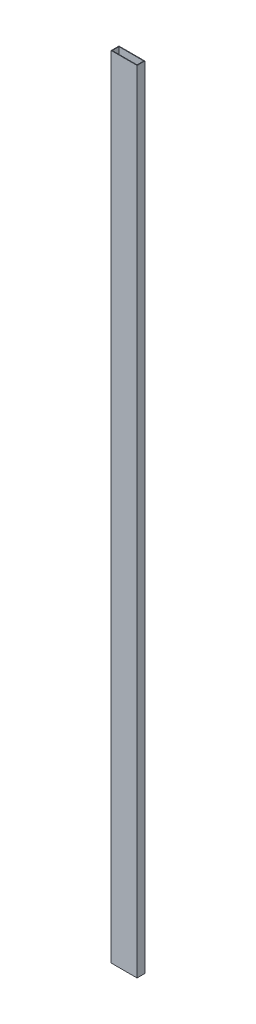
ISO-10303-21;
HEADER;
FILE_DESCRIPTION(('STEP AP214'),'2;1');
FILE_NAME('part.step','',(''),(''),'','','');
FILE_SCHEMA(('AUTOMOTIVE_DESIGN { 1 0 10303 214 1 1 1 1 }'));
ENDSEC;
DATA;
#1=APPLICATION_CONTEXT('core data for automotive mechanical design processes');
#2=APPLICATION_PROTOCOL_DEFINITION('international standard','automotive_design',2000,#1);
#3=PRODUCT_CONTEXT('',#1,'mechanical');
#4=PRODUCT('Part','Part','',(#3));
#5=PRODUCT_RELATED_PRODUCT_CATEGORY('part','',(#4));
#6=PRODUCT_DEFINITION_FORMATION('','',#4);
#7=PRODUCT_DEFINITION_CONTEXT('part definition',#1,'design');
#8=PRODUCT_DEFINITION('design','',#6,#7);
#9=PRODUCT_DEFINITION_SHAPE('','',#8);
#10=(LENGTH_UNIT() NAMED_UNIT(*) SI_UNIT(.MILLI.,.METRE.));
#11=(NAMED_UNIT(*) PLANE_ANGLE_UNIT() SI_UNIT($,.RADIAN.));
#12=(NAMED_UNIT(*) SI_UNIT($,.STERADIAN.) SOLID_ANGLE_UNIT());
#13=UNCERTAINTY_MEASURE_WITH_UNIT(LENGTH_MEASURE(1.E-05),#10,'distance_accuracy_value','');
#14=(GEOMETRIC_REPRESENTATION_CONTEXT(3) GLOBAL_UNCERTAINTY_ASSIGNED_CONTEXT((#13)) GLOBAL_UNIT_ASSIGNED_CONTEXT((#10,
#11,#12)) REPRESENTATION_CONTEXT('',''));
#15=CARTESIAN_POINT('',(0.,0.,0.));
#16=DIRECTION('',(0.,0.,1.));
#17=DIRECTION('',(1.,0.,0.));
#18=AXIS2_PLACEMENT_3D('',#15,#16,#17);
#19=CARTESIAN_POINT('',(0.,3050.,0.));
#20=DIRECTION('',(0.,-1.,0.));
#21=DIRECTION('',(0.,0.,-1.));
#22=AXIS2_PLACEMENT_3D('',#19,#20,#21);
#23=PLANE('',#22);
#24=DIRECTION('',(0.,0.,-1.));
#25=VECTOR('',#24,1.);
#26=CARTESIAN_POINT('',(50.,3050.,15.));
#27=LINE('',#26,#25);
#28=CARTESIAN_POINT('',(50.,3050.,15.));
#29=VERTEX_POINT('',#28);
#30=CARTESIAN_POINT('',(50.,3050.,-15.));
#31=VERTEX_POINT('',#30);
#32=EDGE_CURVE('E153',#29,#31,#27,.T.);
#33=ORIENTED_EDGE('',*,*,#32,.T.);
#34=DIRECTION('',(-1.,0.,0.));
#35=VECTOR('',#34,1.);
#36=CARTESIAN_POINT('',(-50.,3050.,-15.));
#37=LINE('',#36,#35);
#38=CARTESIAN_POINT('',(-50.,3050.,-15.));
#39=VERTEX_POINT('',#38);
#40=EDGE_CURVE('E157',#31,#39,#37,.T.);
#41=ORIENTED_EDGE('',*,*,#40,.T.);
#42=DIRECTION('',(0.,0.,1.));
#43=VECTOR('',#42,1.);
#44=CARTESIAN_POINT('',(-50.,3050.,15.));
#45=LINE('',#44,#43);
#46=CARTESIAN_POINT('',(-50.,3050.,15.));
#47=VERTEX_POINT('',#46);
#48=EDGE_CURVE('E161',#39,#47,#45,.T.);
#49=ORIENTED_EDGE('',*,*,#48,.T.);
#50=DIRECTION('',(1.,0.,0.));
#51=VECTOR('',#50,1.);
#52=CARTESIAN_POINT('',(-50.,3050.,15.));
#53=LINE('',#52,#51);
#54=EDGE_CURVE('E164',#47,#29,#53,.T.);
#55=ORIENTED_EDGE('',*,*,#54,.T.);
#56=EDGE_LOOP('',(#33,#41,#49,#55));
#57=FACE_BOUND('',#56,.T.);
#58=DIRECTION('',(1.,0.,0.));
#59=VECTOR('',#58,1.);
#60=CARTESIAN_POINT('',(-48.,3050.,13.));
#61=LINE('',#60,#59);
#62=CARTESIAN_POINT('',(-48.,3050.,13.));
#63=VERTEX_POINT('',#62);
#64=CARTESIAN_POINT('',(48.,3050.,13.));
#65=VERTEX_POINT('',#64);
#66=EDGE_CURVE('E105',#63,#65,#61,.T.);
#67=ORIENTED_EDGE('',*,*,#66,.F.);
#68=DIRECTION('',(0.,0.,1.));
#69=VECTOR('',#68,1.);
#70=CARTESIAN_POINT('',(-48.,3050.,13.));
#71=LINE('',#70,#69);
#72=CARTESIAN_POINT('',(-48.,3050.,-13.));
#73=VERTEX_POINT('',#72);
#74=EDGE_CURVE('E131',#73,#63,#71,.T.);
#75=ORIENTED_EDGE('',*,*,#74,.F.);
#76=DIRECTION('',(-1.,0.,0.));
#77=VECTOR('',#76,1.);
#78=CARTESIAN_POINT('',(-48.,3050.,-13.));
#79=LINE('',#78,#77);
#80=CARTESIAN_POINT('',(48.,3050.,-13.));
#81=VERTEX_POINT('',#80);
#82=EDGE_CURVE('E127',#81,#73,#79,.T.);
#83=ORIENTED_EDGE('',*,*,#82,.F.);
#84=DIRECTION('',(0.,0.,-1.));
#85=VECTOR('',#84,1.);
#86=CARTESIAN_POINT('',(48.,3050.,13.));
#87=LINE('',#86,#85);
#88=EDGE_CURVE('E114',#65,#81,#87,.T.);
#89=ORIENTED_EDGE('',*,*,#88,.F.);
#90=EDGE_LOOP('',(#67,#75,#83,#89));
#91=FACE_BOUND('',#90,.T.);
#92=ADVANCED_FACE('F39',(#57,#91),#23,.F.);
#93=CARTESIAN_POINT('',(0.,0.,0.));
#94=DIRECTION('',(0.,-1.,0.));
#95=DIRECTION('',(0.,0.,-1.));
#96=AXIS2_PLACEMENT_3D('',#93,#94,#95);
#97=PLANE('',#96);
#98=DIRECTION('',(0.,0.,-1.));
#99=VECTOR('',#98,1.);
#100=CARTESIAN_POINT('',(50.,0.,15.));
#101=LINE('',#100,#99);
#102=CARTESIAN_POINT('',(50.,0.,15.));
#103=VERTEX_POINT('',#102);
#104=CARTESIAN_POINT('',(50.,0.,-15.));
#105=VERTEX_POINT('',#104);
#106=EDGE_CURVE('E123',#103,#105,#101,.T.);
#107=ORIENTED_EDGE('',*,*,#106,.F.);
#108=DIRECTION('',(1.,0.,0.));
#109=VECTOR('',#108,1.);
#110=CARTESIAN_POINT('',(-50.,0.,15.));
#111=LINE('',#110,#109);
#112=CARTESIAN_POINT('',(-50.,0.,15.));
#113=VERTEX_POINT('',#112);
#114=EDGE_CURVE('E158',#113,#103,#111,.T.);
#115=ORIENTED_EDGE('',*,*,#114,.F.);
#116=DIRECTION('',(0.,0.,1.));
#117=VECTOR('',#116,1.);
#118=CARTESIAN_POINT('',(-50.,0.,15.));
#119=LINE('',#118,#117);
#120=CARTESIAN_POINT('',(-50.,0.,-15.));
#121=VERTEX_POINT('',#120);
#122=EDGE_CURVE('E174',#121,#113,#119,.T.);
#123=ORIENTED_EDGE('',*,*,#122,.F.);
#124=DIRECTION('',(-1.,0.,0.));
#125=VECTOR('',#124,1.);
#126=CARTESIAN_POINT('',(-50.,0.,-15.));
#127=LINE('',#126,#125);
#128=EDGE_CURVE('E171',#105,#121,#127,.T.);
#129=ORIENTED_EDGE('',*,*,#128,.F.);
#130=EDGE_LOOP('',(#107,#115,#123,#129));
#131=FACE_BOUND('',#130,.T.);
#132=DIRECTION('',(0.,0.,1.));
#133=VECTOR('',#132,1.);
#134=CARTESIAN_POINT('',(-48.,0.,13.));
#135=LINE('',#134,#133);
#136=CARTESIAN_POINT('',(-48.,0.,-13.));
#137=VERTEX_POINT('',#136);
#138=CARTESIAN_POINT('',(-48.,0.,13.));
#139=VERTEX_POINT('',#138);
#140=EDGE_CURVE('E115',#137,#139,#135,.T.);
#141=ORIENTED_EDGE('',*,*,#140,.T.);
#142=DIRECTION('',(1.,0.,0.));
#143=VECTOR('',#142,1.);
#144=CARTESIAN_POINT('',(-48.,0.,13.));
#145=LINE('',#144,#143);
#146=CARTESIAN_POINT('',(48.,0.,13.));
#147=VERTEX_POINT('',#146);
#148=EDGE_CURVE('E63',#139,#147,#145,.T.);
#149=ORIENTED_EDGE('',*,*,#148,.T.);
#150=DIRECTION('',(0.,0.,-1.));
#151=VECTOR('',#150,1.);
#152=CARTESIAN_POINT('',(48.,0.,13.));
#153=LINE('',#152,#151);
#154=CARTESIAN_POINT('',(48.,0.,-13.));
#155=VERTEX_POINT('',#154);
#156=EDGE_CURVE('E121',#147,#155,#153,.T.);
#157=ORIENTED_EDGE('',*,*,#156,.T.);
#158=DIRECTION('',(-1.,0.,0.));
#159=VECTOR('',#158,1.);
#160=CARTESIAN_POINT('',(-48.,0.,-13.));
#161=LINE('',#160,#159);
#162=EDGE_CURVE('E140',#155,#137,#161,.T.);
#163=ORIENTED_EDGE('',*,*,#162,.T.);
#164=EDGE_LOOP('',(#141,#149,#157,#163));
#165=FACE_BOUND('',#164,.T.);
#166=ADVANCED_FACE('F197',(#131,#165),#97,.T.);
#167=CARTESIAN_POINT('',(50.,3050.,15.));
#168=DIRECTION('',(-1.,0.,0.));
#169=DIRECTION('',(0.,0.,1.));
#170=AXIS2_PLACEMENT_3D('',#167,#168,#169);
#171=PLANE('',#170);
#172=ORIENTED_EDGE('',*,*,#106,.T.);
#173=DIRECTION('',(0.,-1.,0.));
#174=VECTOR('',#173,1.);
#175=CARTESIAN_POINT('',(50.,3050.,-15.));
#176=LINE('',#175,#174);
#177=EDGE_CURVE('E11',#31,#105,#176,.T.);
#178=ORIENTED_EDGE('',*,*,#177,.F.);
#179=ORIENTED_EDGE('',*,*,#32,.F.);
#180=DIRECTION('',(0.,-1.,0.));
#181=VECTOR('',#180,1.);
#182=CARTESIAN_POINT('',(50.,3050.,15.));
#183=LINE('',#182,#181);
#184=EDGE_CURVE('E167',#29,#103,#183,.T.);
#185=ORIENTED_EDGE('',*,*,#184,.T.);
#186=EDGE_LOOP('',(#172,#178,#179,#185));
#187=FACE_BOUND('',#186,.T.);
#188=ADVANCED_FACE('F41',(#187),#171,.F.);
#189=CARTESIAN_POINT('',(-50.,3050.,-15.));
#190=DIRECTION('',(0.,0.,1.));
#191=DIRECTION('',(1.,0.,0.));
#192=AXIS2_PLACEMENT_3D('',#189,#190,#191);
#193=PLANE('',#192);
#194=ORIENTED_EDGE('',*,*,#128,.T.);
#195=DIRECTION('',(0.,-1.,0.));
#196=VECTOR('',#195,1.);
#197=CARTESIAN_POINT('',(-50.,3050.,-15.));
#198=LINE('',#197,#196);
#199=EDGE_CURVE('E48',#39,#121,#198,.T.);
#200=ORIENTED_EDGE('',*,*,#199,.F.);
#201=ORIENTED_EDGE('',*,*,#40,.F.);
#202=ORIENTED_EDGE('',*,*,#177,.T.);
#203=EDGE_LOOP('',(#194,#200,#201,#202));
#204=FACE_BOUND('',#203,.T.);
#205=ADVANCED_FACE('F207',(#204),#193,.F.);
#206=CARTESIAN_POINT('',(-50.,3050.,15.));
#207=DIRECTION('',(1.,0.,0.));
#208=DIRECTION('',(0.,0.,-1.));
#209=AXIS2_PLACEMENT_3D('',#206,#207,#208);
#210=PLANE('',#209);
#211=ORIENTED_EDGE('',*,*,#122,.T.);
#212=DIRECTION('',(0.,-1.,0.));
#213=VECTOR('',#212,1.);
#214=CARTESIAN_POINT('',(-50.,3050.,15.));
#215=LINE('',#214,#213);
#216=EDGE_CURVE('E182',#47,#113,#215,.T.);
#217=ORIENTED_EDGE('',*,*,#216,.F.);
#218=ORIENTED_EDGE('',*,*,#48,.F.);
#219=ORIENTED_EDGE('',*,*,#199,.T.);
#220=EDGE_LOOP('',(#211,#217,#218,#219));
#221=FACE_BOUND('',#220,.T.);
#222=ADVANCED_FACE('F191',(#221),#210,.F.);
#223=CARTESIAN_POINT('',(-50.,3050.,15.));
#224=DIRECTION('',(0.,0.,-1.));
#225=DIRECTION('',(-1.,0.,0.));
#226=AXIS2_PLACEMENT_3D('',#223,#224,#225);
#227=PLANE('',#226);
#228=ORIENTED_EDGE('',*,*,#114,.T.);
#229=ORIENTED_EDGE('',*,*,#184,.F.);
#230=ORIENTED_EDGE('',*,*,#54,.F.);
#231=ORIENTED_EDGE('',*,*,#216,.T.);
#232=EDGE_LOOP('',(#228,#229,#230,#231));
#233=FACE_BOUND('',#232,.T.);
#234=ADVANCED_FACE('F201',(#233),#227,.F.);
#235=CARTESIAN_POINT('',(-48.,3050.,13.));
#236=DIRECTION('',(0.,0.,-1.));
#237=DIRECTION('',(-1.,0.,0.));
#238=AXIS2_PLACEMENT_3D('',#235,#236,#237);
#239=PLANE('',#238);
#240=ORIENTED_EDGE('',*,*,#148,.F.);
#241=DIRECTION('',(0.,-1.,0.));
#242=VECTOR('',#241,1.);
#243=CARTESIAN_POINT('',(-48.,3050.,13.));
#244=LINE('',#243,#242);
#245=EDGE_CURVE('E109',#63,#139,#244,.T.);
#246=ORIENTED_EDGE('',*,*,#245,.F.);
#247=ORIENTED_EDGE('',*,*,#66,.T.);
#248=DIRECTION('',(0.,-1.,0.));
#249=VECTOR('',#248,1.);
#250=CARTESIAN_POINT('',(48.,3050.,13.));
#251=LINE('',#250,#249);
#252=EDGE_CURVE('E108',#65,#147,#251,.T.);
#253=ORIENTED_EDGE('',*,*,#252,.T.);
#254=EDGE_LOOP('',(#240,#246,#247,#253));
#255=FACE_BOUND('',#254,.T.);
#256=ADVANCED_FACE('F107',(#255),#239,.T.);
#257=CARTESIAN_POINT('',(48.,3050.,13.));
#258=DIRECTION('',(-1.,0.,0.));
#259=DIRECTION('',(0.,0.,1.));
#260=AXIS2_PLACEMENT_3D('',#257,#258,#259);
#261=PLANE('',#260);
#262=ORIENTED_EDGE('',*,*,#156,.F.);
#263=ORIENTED_EDGE('',*,*,#252,.F.);
#264=ORIENTED_EDGE('',*,*,#88,.T.);
#265=DIRECTION('',(0.,-1.,0.));
#266=VECTOR('',#265,1.);
#267=CARTESIAN_POINT('',(48.,3050.,-13.));
#268=LINE('',#267,#266);
#269=EDGE_CURVE('E124',#81,#155,#268,.T.);
#270=ORIENTED_EDGE('',*,*,#269,.T.);
#271=EDGE_LOOP('',(#262,#263,#264,#270));
#272=FACE_BOUND('',#271,.T.);
#273=ADVANCED_FACE('F118',(#272),#261,.T.);
#274=CARTESIAN_POINT('',(-48.,3050.,-13.));
#275=DIRECTION('',(0.,0.,1.));
#276=DIRECTION('',(1.,0.,0.));
#277=AXIS2_PLACEMENT_3D('',#274,#275,#276);
#278=PLANE('',#277);
#279=ORIENTED_EDGE('',*,*,#162,.F.);
#280=ORIENTED_EDGE('',*,*,#269,.F.);
#281=ORIENTED_EDGE('',*,*,#82,.T.);
#282=DIRECTION('',(0.,-1.,0.));
#283=VECTOR('',#282,1.);
#284=CARTESIAN_POINT('',(-48.,3050.,-13.));
#285=LINE('',#284,#283);
#286=EDGE_CURVE('E55',#73,#137,#285,.T.);
#287=ORIENTED_EDGE('',*,*,#286,.T.);
#288=EDGE_LOOP('',(#279,#280,#281,#287));
#289=FACE_BOUND('',#288,.T.);
#290=ADVANCED_FACE('F230',(#289),#278,.T.);
#291=CARTESIAN_POINT('',(-48.,3050.,13.));
#292=DIRECTION('',(1.,0.,0.));
#293=DIRECTION('',(0.,0.,-1.));
#294=AXIS2_PLACEMENT_3D('',#291,#292,#293);
#295=PLANE('',#294);
#296=ORIENTED_EDGE('',*,*,#140,.F.);
#297=ORIENTED_EDGE('',*,*,#286,.F.);
#298=ORIENTED_EDGE('',*,*,#74,.T.);
#299=ORIENTED_EDGE('',*,*,#245,.T.);
#300=EDGE_LOOP('',(#296,#297,#298,#299));
#301=FACE_BOUND('',#300,.T.);
#302=ADVANCED_FACE('F234',(#301),#295,.T.);
#303=CLOSED_SHELL('',(#92,#166,#188,#205,#222,#234,#256,#273,#290,#302));
#304=MANIFOLD_SOLID_BREP('B2',#303);
#305=ADVANCED_BREP_SHAPE_REPRESENTATION('',(#18,#304),#14);
#306=SHAPE_DEFINITION_REPRESENTATION(#9,#305);
ENDSEC;
END-ISO-10303-21;
